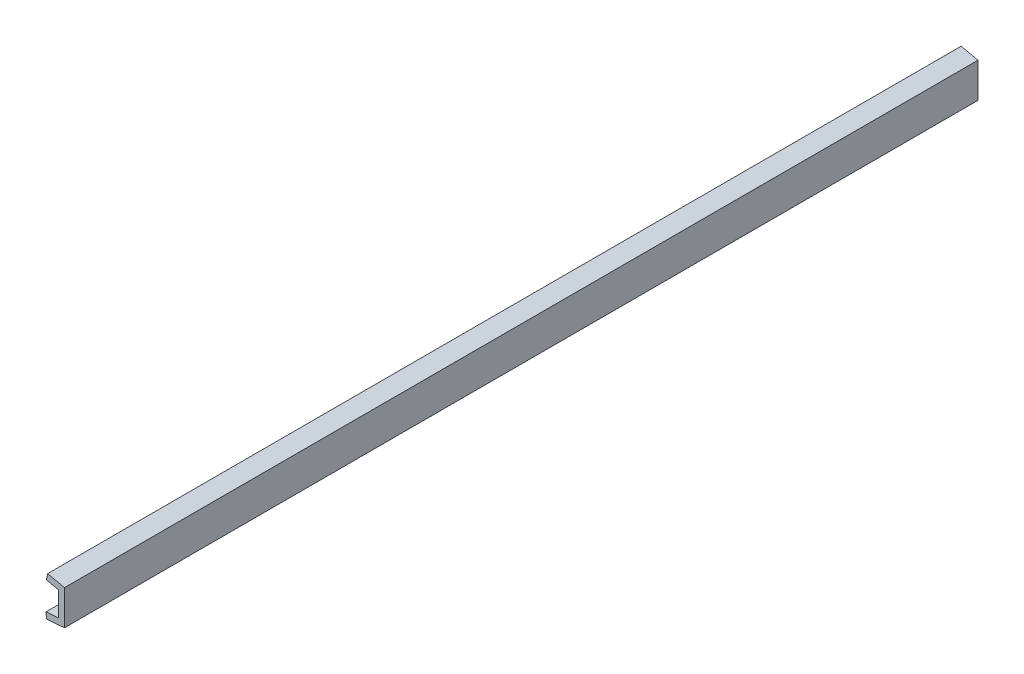
ISO-10303-21;
HEADER;
FILE_DESCRIPTION(('STEP AP214'),'2;1');
FILE_NAME('part.step','',(''),(''),'','','');
FILE_SCHEMA(('AUTOMOTIVE_DESIGN { 1 0 10303 214 1 1 1 1 }'));
ENDSEC;
DATA;
#1=APPLICATION_CONTEXT('core data for automotive mechanical design processes');
#2=APPLICATION_PROTOCOL_DEFINITION('international standard','automotive_design',2000,#1);
#3=PRODUCT_CONTEXT('',#1,'mechanical');
#4=PRODUCT('Part','Part','',(#3));
#5=PRODUCT_RELATED_PRODUCT_CATEGORY('part','',(#4));
#6=PRODUCT_DEFINITION_FORMATION('','',#4);
#7=PRODUCT_DEFINITION_CONTEXT('part definition',#1,'design');
#8=PRODUCT_DEFINITION('design','',#6,#7);
#9=PRODUCT_DEFINITION_SHAPE('','',#8);
#10=(LENGTH_UNIT() NAMED_UNIT(*) SI_UNIT(.MILLI.,.METRE.));
#11=(NAMED_UNIT(*) PLANE_ANGLE_UNIT() SI_UNIT($,.RADIAN.));
#12=(NAMED_UNIT(*) SI_UNIT($,.STERADIAN.) SOLID_ANGLE_UNIT());
#13=UNCERTAINTY_MEASURE_WITH_UNIT(LENGTH_MEASURE(1.E-05),#10,'distance_accuracy_value','');
#14=(GEOMETRIC_REPRESENTATION_CONTEXT(3) GLOBAL_UNCERTAINTY_ASSIGNED_CONTEXT((#13)) GLOBAL_UNIT_ASSIGNED_CONTEXT((#10,
#11,#12)) REPRESENTATION_CONTEXT('',''));
#15=CARTESIAN_POINT('',(0.,0.,0.));
#16=DIRECTION('',(0.,0.,1.));
#17=DIRECTION('',(1.,0.,0.));
#18=AXIS2_PLACEMENT_3D('',#15,#16,#17);
#19=CARTESIAN_POINT('',(208.349747658372,16.1617121481259,750.));
#20=DIRECTION('',(0.997004948709944,0.0773377802104559,0.));
#21=DIRECTION('',(-0.0773377802104559,0.997004948709945,0.));
#22=AXIS2_PLACEMENT_3D('',#19,#20,#21);
#23=PLANE('',#22);
#24=DIRECTION('',(0.0773377802104559,-0.997004948709945,0.));
#25=VECTOR('',#24,1.);
#26=CARTESIAN_POINT('',(208.349747658372,16.1617121481259,0.));
#27=LINE('',#26,#25);
#28=CARTESIAN_POINT('',(209.786901689684,-2.36545112676601,0.));
#29=VERTEX_POINT('',#28);
#30=CARTESIAN_POINT('',(210.173597998823,-7.35057137214407,0.));
#31=VERTEX_POINT('',#30);
#32=EDGE_CURVE('E135',#29,#31,#27,.T.);
#33=ORIENTED_EDGE('',*,*,#32,.T.);
#34=DIRECTION('',(0.,0.,-1.));
#35=VECTOR('',#34,1.);
#36=CARTESIAN_POINT('',(210.173597998823,-7.35057137214407,750.));
#37=LINE('',#36,#35);
#38=CARTESIAN_POINT('',(210.173597998823,-7.35057137214407,750.));
#39=VERTEX_POINT('',#38);
#40=EDGE_CURVE('E11',#39,#31,#37,.T.);
#41=ORIENTED_EDGE('',*,*,#40,.F.);
#42=DIRECTION('',(0.0773377802104559,-0.997004948709945,0.));
#43=VECTOR('',#42,1.);
#44=CARTESIAN_POINT('',(208.349747658372,16.1617121481259,750.));
#45=LINE('',#44,#43);
#46=CARTESIAN_POINT('',(209.786901689684,-2.36545112676601,750.));
#47=VERTEX_POINT('',#46);
#48=EDGE_CURVE('E162',#47,#39,#45,.T.);
#49=ORIENTED_EDGE('',*,*,#48,.F.);
#50=DIRECTION('',(0.,0.,-1.));
#51=VECTOR('',#50,1.);
#52=CARTESIAN_POINT('',(209.786901689684,-2.36545112676601,750.));
#53=LINE('',#52,#51);
#54=EDGE_CURVE('E131',#47,#29,#53,.T.);
#55=ORIENTED_EDGE('',*,*,#54,.T.);
#56=EDGE_LOOP('',(#33,#41,#49,#55));
#57=FACE_BOUND('',#56,.T.);
#58=ADVANCED_FACE('F41',(#57),#23,.F.);
#59=CARTESIAN_POINT('',(6.86010343152365E-10,-3.46758732944648E-09,750.));
#60=CARTESIAN_POINT('',(0.08168428698684,-0.412642687048914,750.));
#61=CARTESIAN_POINT('',(0.29643779221108,-1.23084882425444,750.));
#62=CARTESIAN_POINT('',(0.768361471156949,-2.41716894104676,750.));
#63=CARTESIAN_POINT('',(1.39503923147957,-3.55210015011684,750.));
#64=CARTESIAN_POINT('',(2.16439563511027,-4.63750206900586,750.));
#65=CARTESIAN_POINT('',(3.06393370947614,-5.68077839054713,750.));
#66=CARTESIAN_POINT('',(4.11804776311139,-6.66154416179366,750.));
#67=CARTESIAN_POINT('',(5.29953436327256,-7.60405965629537,750.));
#68=CARTESIAN_POINT('',(6.62863449802136,-8.49170476482325,750.));
#69=CARTESIAN_POINT('',(8.08798571884851,-9.34013183682808,750.));
#70=CARTESIAN_POINT('',(9.68204057253338,-10.139020115648,750.));
#71=CARTESIAN_POINT('',(11.4030680916886,-10.884858394614,750.));
#72=CARTESIAN_POINT('',(13.2505090341335,-11.589254086622,750.));
#73=CARTESIAN_POINT('',(15.2269841697117,-12.2280550439366,750.));
#74=CARTESIAN_POINT('',(17.3219522475322,-12.8451616004499,750.));
#75=CARTESIAN_POINT('',(19.5427708769133,-13.3974736552887,750.));
#76=CARTESIAN_POINT('',(21.8793057893119,-13.9187021646013,750.));
#77=CARTESIAN_POINT('',(24.3338022228834,-14.3886167059853,750.));
#78=CARTESIAN_POINT('',(26.9026774808353,-14.802759919061,750.));
#79=CARTESIAN_POINT('',(29.5790329825374,-15.1866441069216,750.));
#80=CARTESIAN_POINT('',(32.3647270664427,-15.5073171420312,750.));
#81=CARTESIAN_POINT('',(35.2497968202069,-15.8183955505852,750.));
#82=CARTESIAN_POINT('',(38.2422431604414,-16.0454461885373,750.));
#83=CARTESIAN_POINT('',(41.3318285242188,-16.2609817770736,750.));
#84=CARTESIAN_POINT('',(44.5190158754654,-16.4283061200292,750.));
#85=CARTESIAN_POINT('',(47.799283262828,-16.5581196969077,750.));
#86=CARTESIAN_POINT('',(51.1662389701078,-16.6479328939463,750.));
#87=CARTESIAN_POINT('',(54.6198609300622,-16.695073810502,750.));
#88=CARTESIAN_POINT('',(58.1599653505791,-16.7142959907614,750.));
#89=CARTESIAN_POINT('',(61.7835188431424,-16.7082647171375,750.));
#90=CARTESIAN_POINT('',(65.4834633590841,-16.6508259867193,750.));
#91=CARTESIAN_POINT('',(69.2569856491823,-16.5848920488685,750.));
#92=CARTESIAN_POINT('',(73.1037745798507,-16.4844848850199,750.));
#93=CARTESIAN_POINT('',(77.0202592722721,-16.3508026196804,750.));
#94=CARTESIAN_POINT('',(81.0039794969251,-16.2056434379451,750.));
#95=CARTESIAN_POINT('',(85.0500683642102,-16.0180896331925,750.));
#96=CARTESIAN_POINT('',(89.1571653787501,-15.8337159379273,750.));
#97=CARTESIAN_POINT('',(93.3201451343298,-15.6193919065088,750.));
#98=CARTESIAN_POINT('',(97.5368210232667,-15.3996749242203,750.));
#99=CARTESIAN_POINT('',(101.80725321727,-15.1737887607578,750.));
#100=CARTESIAN_POINT('',(106.123150677686,-14.9168069756067,750.));
#101=CARTESIAN_POINT('',(110.483633276907,-14.6718318403938,750.));
#102=CARTESIAN_POINT('',(114.883266317732,-14.4088537299499,750.));
#103=CARTESIAN_POINT('',(119.352975093204,-14.1438502002129,750.));
#104=CARTESIAN_POINT('',(123.894349232029,-13.8970193049098,750.));
#105=CARTESIAN_POINT('',(128.496857286776,-13.5995010083276,750.));
#106=CARTESIAN_POINT('',(133.130234778128,-13.3003240217907,750.));
#107=CARTESIAN_POINT('',(137.784055517228,-12.993867356776,750.));
#108=CARTESIAN_POINT('',(142.453682427155,-12.6614740565246,750.));
#109=CARTESIAN_POINT('',(147.129863452571,-12.318169380912,750.));
#110=CARTESIAN_POINT('',(151.814228379386,-11.9853167344393,750.));
#111=CARTESIAN_POINT('',(156.499893797324,-11.6185724445053,750.));
#112=CARTESIAN_POINT('',(161.183377828108,-11.2606019236378,750.));
#113=CARTESIAN_POINT('',(165.860460189637,-10.9025488597506,750.));
#114=CARTESIAN_POINT('',(170.523341725827,-10.5300973915269,750.));
#115=CARTESIAN_POINT('',(175.170121140126,-10.1615202930905,750.));
#116=CARTESIAN_POINT('',(179.793367843169,-9.79042877802554,750.));
#117=CARTESIAN_POINT('',(184.390167200322,-9.42207701846059,750.));
#118=CARTESIAN_POINT('',(188.959593481163,-9.04825961775901,750.));
#119=CARTESIAN_POINT('',(193.496862610415,-8.69245709593373,750.));
#120=CARTESIAN_POINT('',(197.993446271768,-8.33140201520253,750.));
#121=CARTESIAN_POINT('',(202.443627904182,-7.97364305459564,750.));
#122=CARTESIAN_POINT('',(206.842502753098,-7.60628208488407,750.));
#123=CARTESIAN_POINT('',(211.190292550163,-7.27370176009231,750.));
#124=CARTESIAN_POINT('',(215.480211958673,-6.93265212483035,750.));
#125=CARTESIAN_POINT('',(219.709739235407,-6.59006458587067,750.));
#126=CARTESIAN_POINT('',(223.873233644342,-6.26206836723984,750.));
#127=CARTESIAN_POINT('',(227.966396089271,-5.9398476619633,750.));
#128=CARTESIAN_POINT('',(231.983748001244,-5.63533938180436,750.));
#129=CARTESIAN_POINT('',(235.919297627122,-5.31754575452866,750.));
#130=CARTESIAN_POINT('',(239.77370870658,-5.03491559697022,750.));
#131=CARTESIAN_POINT('',(243.536538120906,-4.74165773777177,750.));
#132=CARTESIAN_POINT('',(247.209812190136,-4.46085993007788,750.));
#133=CARTESIAN_POINT('',(250.787106764707,-4.19576061649392,750.));
#134=CARTESIAN_POINT('',(254.266072169246,-3.91883561359546,750.));
#135=CARTESIAN_POINT('',(257.643250160136,-3.6721839334308,750.));
#136=CARTESIAN_POINT('',(260.913793207287,-3.4361759851998,750.));
#137=CARTESIAN_POINT('',(264.072684975458,-3.18790963619195,750.));
#138=CARTESIAN_POINT('',(267.117194027154,-2.9771463747341,750.));
#139=CARTESIAN_POINT('',(270.043161250345,-2.75101341585552,750.));
#140=CARTESIAN_POINT('',(272.846765873569,-2.54470011257798,750.));
#141=CARTESIAN_POINT('',(275.52942919854,-2.33878815971674,750.));
#142=CARTESIAN_POINT('',(278.087148077472,-2.16666667438527,750.));
#143=CARTESIAN_POINT('',(280.513268395164,-1.98242531383613,750.));
#144=CARTESIAN_POINT('',(282.806745265545,-1.81443576932335,750.));
#145=CARTESIAN_POINT('',(284.962823137036,-1.64955214309113,750.));
#146=CARTESIAN_POINT('',(286.983837233579,-1.51701069421092,750.));
#147=CARTESIAN_POINT('',(288.86325736509,-1.37227380954508,750.));
#148=CARTESIAN_POINT('',(290.600165155571,-1.24558756488331,750.));
#149=CARTESIAN_POINT('',(292.192790163112,-1.11915950224588,750.));
#150=CARTESIAN_POINT('',(293.640594785675,-1.02816418679108,750.));
#151=CARTESIAN_POINT('',(294.939565332546,-0.92070431694592,750.));
#152=CARTESIAN_POINT('',(296.089960300949,-0.842870725052759,750.));
#153=CARTESIAN_POINT('',(297.090587220823,-0.777681987494267,750.));
#154=CARTESIAN_POINT('',(297.939585238316,-0.70130185738506,750.));
#155=CARTESIAN_POINT('',(298.636651950482,-0.653077401387046,750.));
#156=CARTESIAN_POINT('',(299.177018781558,-0.618208826708505,750.));
#157=CARTESIAN_POINT('',(299.562595701666,-0.575799674164568,750.));
#158=CARTESIAN_POINT('',(299.79734919339,-0.578243239164238,750.));
#159=CARTESIAN_POINT('',(299.90336017084,-0.563663730262078,750.));
#160=CARTESIAN_POINT('',(299.929999999991,-0.559999999999512,750.));
#161=B_SPLINE_CURVE_WITH_KNOTS('',3,(#59,#60,#61,#62,#63,#64,#65,#66,#67,#68,#69,#70,#71,#72,
#73,#74,#75,#76,#77,#78,#79,#80,#81,#82,#83,#84,#85,#86,#87,#88,#89,#90,#91,#92,#93,#94,#95,#96,
#97,#98,#99,#100,#101,#102,#103,#104,#105,#106,#107,#108,#109,#110,#111,#112,#113,#114,#115,
#116,#117,#118,#119,#120,#121,#122,#123,#124,#125,#126,#127,#128,#129,#130,#131,#132,#133,#134,
#135,#136,#137,#138,#139,#140,#141,#142,#143,#144,#145,#146,#147,#148,#149,#150,#151,#152,#153,
#154,#155,#156,#157,#158,#159,#160),.UNSPECIFIED.,.F.,.F.,(4,1,1,1,1,1,1,1,1,1,1,1,1,1,1,1,1,1,
1,1,1,1,1,1,1,1,1,1,1,1,1,1,1,1,1,1,1,1,1,1,1,1,1,1,1,1,1,1,1,1,1,1,1,1,1,1,1,1,1,1,1,1,1,1,1,1,
1,1,1,1,1,1,1,1,1,1,1,1,1,1,1,1,1,1,1,1,1,1,1,1,1,1,1,1,1,1,1,1,1,4),(0.510394165054345,
0.512411362351637,0.514442775005336,0.516504186146814,0.518616282986581,0.520815941374538,
0.52310137417107,0.52551420412258,0.528060370238057,0.530762306993531,0.533608996019813,
0.536610005944519,0.539758552070476,0.543091515136878,0.546573596537661,0.550235349948387,
0.554069096490516,0.558058926974622,0.562223754924467,0.566552856289207,0.571030234918836,
0.575677161731586,0.580474566261676,0.585427924053139,0.590537055672864,0.595787006934838,
0.601178701806172,0.606697001543169,0.612358752726766,0.618164376111839,0.624082471505276,
0.630113019620036,0.636272552317013,0.64254540865324,0.648915297875715,0.655399015903059,
0.661979320195946,0.668641043209263,0.675399420045521,0.682238498238121,0.689159203277062,
0.696143776007776,0.703193143687113,0.710306374538354,0.717627174011905,0.725014701728468,
0.732435170353137,0.739904563937781,0.747392102399747,0.754896736460748,0.762401370521748,
0.769924336473027,0.777447302424306,0.784938375809219,0.792430695411681,0.799891128581962,
0.807303733725319,0.814684454614634,0.822017350797373,0.829301142641949,0.836521162869281,
0.843661473655919,0.850722080825709,0.857700425049739,0.864583104763581,0.87137012832007,
0.87806022371642,0.884621511633568,0.891069943428069,0.897390814479484,0.903565713862671,
0.909613035181241,0.915499668178881,0.921241563258684,0.926823990297297,0.932244523470366,
0.93748842971305,0.942556896933455,0.947447554919404,0.952130861472029,0.956637537170943,
0.960935685066861,0.965040101801286,0.968937143772775,0.972609708612879,0.97607374592087,
0.979312161013132,0.982327244194811,0.985117850528837,0.987668031890042,0.989992582174607,
0.992077865387908,0.993921550450856,0.995524803260075,0.996888843664504,0.998011233445347,
0.998877242772344,0.999486882686978,0.999871057150102,1.),.UNSPECIFIED.);
#162=DIRECTION('',(0.,0.,-1.));
#163=VECTOR('',#162,1.);
#164=SURFACE_OF_LINEAR_EXTRUSION('',#161,#163);
#165=CARTESIAN_POINT('',(6.86010343152365E-10,-3.46758732944648E-09,0.));
#166=CARTESIAN_POINT('',(0.08168428698684,-0.412642687048914,0.));
#167=CARTESIAN_POINT('',(0.29643779221108,-1.23084882425444,0.));
#168=CARTESIAN_POINT('',(0.768361471156949,-2.41716894104676,0.));
#169=CARTESIAN_POINT('',(1.39503923147957,-3.55210015011684,0.));
#170=CARTESIAN_POINT('',(2.16439563511027,-4.63750206900586,0.));
#171=CARTESIAN_POINT('',(3.06393370947614,-5.68077839054713,0.));
#172=CARTESIAN_POINT('',(4.11804776311139,-6.66154416179366,0.));
#173=CARTESIAN_POINT('',(5.29953436327256,-7.60405965629537,0.));
#174=CARTESIAN_POINT('',(6.62863449802136,-8.49170476482325,0.));
#175=CARTESIAN_POINT('',(8.08798571884851,-9.34013183682808,0.));
#176=CARTESIAN_POINT('',(9.68204057253338,-10.139020115648,0.));
#177=CARTESIAN_POINT('',(11.4030680916886,-10.884858394614,0.));
#178=CARTESIAN_POINT('',(13.2505090341335,-11.589254086622,0.));
#179=CARTESIAN_POINT('',(15.2269841697117,-12.2280550439366,0.));
#180=CARTESIAN_POINT('',(17.3219522475322,-12.8451616004499,0.));
#181=CARTESIAN_POINT('',(19.5427708769133,-13.3974736552887,0.));
#182=CARTESIAN_POINT('',(21.8793057893119,-13.9187021646013,0.));
#183=CARTESIAN_POINT('',(24.3338022228834,-14.3886167059853,0.));
#184=CARTESIAN_POINT('',(26.9026774808353,-14.802759919061,0.));
#185=CARTESIAN_POINT('',(29.5790329825374,-15.1866441069216,0.));
#186=CARTESIAN_POINT('',(32.3647270664427,-15.5073171420312,0.));
#187=CARTESIAN_POINT('',(35.2497968202069,-15.8183955505852,0.));
#188=CARTESIAN_POINT('',(38.2422431604414,-16.0454461885373,0.));
#189=CARTESIAN_POINT('',(41.3318285242188,-16.2609817770736,0.));
#190=CARTESIAN_POINT('',(44.5190158754654,-16.4283061200292,0.));
#191=CARTESIAN_POINT('',(47.799283262828,-16.5581196969077,0.));
#192=CARTESIAN_POINT('',(51.1662389701078,-16.6479328939463,0.));
#193=CARTESIAN_POINT('',(54.6198609300622,-16.695073810502,0.));
#194=CARTESIAN_POINT('',(58.1599653505791,-16.7142959907614,0.));
#195=CARTESIAN_POINT('',(61.7835188431424,-16.7082647171375,0.));
#196=CARTESIAN_POINT('',(65.4834633590841,-16.6508259867193,0.));
#197=CARTESIAN_POINT('',(69.2569856491823,-16.5848920488685,0.));
#198=CARTESIAN_POINT('',(73.1037745798507,-16.4844848850199,0.));
#199=CARTESIAN_POINT('',(77.0202592722721,-16.3508026196804,0.));
#200=CARTESIAN_POINT('',(81.0039794969251,-16.2056434379451,0.));
#201=CARTESIAN_POINT('',(85.0500683642102,-16.0180896331925,0.));
#202=CARTESIAN_POINT('',(89.1571653787501,-15.8337159379273,0.));
#203=CARTESIAN_POINT('',(93.3201451343298,-15.6193919065088,0.));
#204=CARTESIAN_POINT('',(97.5368210232667,-15.3996749242203,0.));
#205=CARTESIAN_POINT('',(101.80725321727,-15.1737887607578,0.));
#206=CARTESIAN_POINT('',(106.123150677686,-14.9168069756067,0.));
#207=CARTESIAN_POINT('',(110.483633276907,-14.6718318403938,0.));
#208=CARTESIAN_POINT('',(114.883266317732,-14.4088537299499,0.));
#209=CARTESIAN_POINT('',(119.352975093204,-14.1438502002129,0.));
#210=CARTESIAN_POINT('',(123.894349232029,-13.8970193049098,0.));
#211=CARTESIAN_POINT('',(128.496857286776,-13.5995010083276,0.));
#212=CARTESIAN_POINT('',(133.130234778128,-13.3003240217907,0.));
#213=CARTESIAN_POINT('',(137.784055517228,-12.993867356776,0.));
#214=CARTESIAN_POINT('',(142.453682427155,-12.6614740565246,0.));
#215=CARTESIAN_POINT('',(147.129863452571,-12.318169380912,0.));
#216=CARTESIAN_POINT('',(151.814228379386,-11.9853167344393,0.));
#217=CARTESIAN_POINT('',(156.499893797324,-11.6185724445053,0.));
#218=CARTESIAN_POINT('',(161.183377828108,-11.2606019236378,0.));
#219=CARTESIAN_POINT('',(165.860460189637,-10.9025488597506,0.));
#220=CARTESIAN_POINT('',(170.523341725827,-10.5300973915269,0.));
#221=CARTESIAN_POINT('',(175.170121140126,-10.1615202930905,0.));
#222=CARTESIAN_POINT('',(179.793367843169,-9.79042877802554,0.));
#223=CARTESIAN_POINT('',(184.390167200322,-9.42207701846059,0.));
#224=CARTESIAN_POINT('',(188.959593481163,-9.04825961775901,0.));
#225=CARTESIAN_POINT('',(193.496862610415,-8.69245709593373,0.));
#226=CARTESIAN_POINT('',(197.993446271768,-8.33140201520253,0.));
#227=CARTESIAN_POINT('',(202.443627904182,-7.97364305459564,0.));
#228=CARTESIAN_POINT('',(206.842502753098,-7.60628208488407,0.));
#229=CARTESIAN_POINT('',(211.190292550163,-7.27370176009231,0.));
#230=CARTESIAN_POINT('',(215.480211958673,-6.93265212483035,0.));
#231=CARTESIAN_POINT('',(219.709739235407,-6.59006458587067,0.));
#232=CARTESIAN_POINT('',(223.873233644342,-6.26206836723984,0.));
#233=CARTESIAN_POINT('',(227.966396089271,-5.9398476619633,0.));
#234=CARTESIAN_POINT('',(231.983748001244,-5.63533938180436,0.));
#235=CARTESIAN_POINT('',(235.919297627122,-5.31754575452866,0.));
#236=CARTESIAN_POINT('',(239.77370870658,-5.03491559697022,0.));
#237=CARTESIAN_POINT('',(243.536538120906,-4.74165773777177,0.));
#238=CARTESIAN_POINT('',(247.209812190136,-4.46085993007788,0.));
#239=CARTESIAN_POINT('',(250.787106764707,-4.19576061649392,0.));
#240=CARTESIAN_POINT('',(254.266072169246,-3.91883561359546,0.));
#241=CARTESIAN_POINT('',(257.643250160136,-3.6721839334308,0.));
#242=CARTESIAN_POINT('',(260.913793207287,-3.4361759851998,0.));
#243=CARTESIAN_POINT('',(264.072684975458,-3.18790963619195,0.));
#244=CARTESIAN_POINT('',(267.117194027154,-2.9771463747341,0.));
#245=CARTESIAN_POINT('',(270.043161250345,-2.75101341585552,0.));
#246=CARTESIAN_POINT('',(272.846765873569,-2.54470011257798,0.));
#247=CARTESIAN_POINT('',(275.52942919854,-2.33878815971674,0.));
#248=CARTESIAN_POINT('',(278.087148077472,-2.16666667438527,0.));
#249=CARTESIAN_POINT('',(280.513268395164,-1.98242531383613,0.));
#250=CARTESIAN_POINT('',(282.806745265545,-1.81443576932335,0.));
#251=CARTESIAN_POINT('',(284.962823137036,-1.64955214309113,0.));
#252=CARTESIAN_POINT('',(286.983837233579,-1.51701069421092,0.));
#253=CARTESIAN_POINT('',(288.86325736509,-1.37227380954508,0.));
#254=CARTESIAN_POINT('',(290.600165155571,-1.24558756488331,0.));
#255=CARTESIAN_POINT('',(292.192790163112,-1.11915950224588,0.));
#256=CARTESIAN_POINT('',(293.640594785675,-1.02816418679108,0.));
#257=CARTESIAN_POINT('',(294.939565332546,-0.92070431694592,0.));
#258=CARTESIAN_POINT('',(296.089960300949,-0.842870725052759,0.));
#259=CARTESIAN_POINT('',(297.090587220823,-0.777681987494267,0.));
#260=CARTESIAN_POINT('',(297.939585238316,-0.70130185738506,0.));
#261=CARTESIAN_POINT('',(298.636651950482,-0.653077401387046,0.));
#262=CARTESIAN_POINT('',(299.177018781558,-0.618208826708505,0.));
#263=CARTESIAN_POINT('',(299.562595701666,-0.575799674164568,0.));
#264=CARTESIAN_POINT('',(299.79734919339,-0.578243239164238,0.));
#265=CARTESIAN_POINT('',(299.90336017084,-0.563663730262078,0.));
#266=CARTESIAN_POINT('',(299.929999999991,-0.559999999999512,0.));
#267=B_SPLINE_CURVE_WITH_KNOTS('',3,(#165,#166,#167,#168,#169,#170,#171,#172,#173,#174,#175,
#176,#177,#178,#179,#180,#181,#182,#183,#184,#185,#186,#187,#188,#189,#190,#191,#192,#193,#194,
#195,#196,#197,#198,#199,#200,#201,#202,#203,#204,#205,#206,#207,#208,#209,#210,#211,#212,#213,
#214,#215,#216,#217,#218,#219,#220,#221,#222,#223,#224,#225,#226,#227,#228,#229,#230,#231,#232,
#233,#234,#235,#236,#237,#238,#239,#240,#241,#242,#243,#244,#245,#246,#247,#248,#249,#250,#251,
#252,#253,#254,#255,#256,#257,#258,#259,#260,#261,#262,#263,#264,#265,#266),.UNSPECIFIED.,.F.,
.F.,(4,1,1,1,1,1,1,1,1,1,1,1,1,1,1,1,1,1,1,1,1,1,1,1,1,1,1,1,1,1,1,1,1,1,1,1,1,1,1,1,1,1,1,1,1,
1,1,1,1,1,1,1,1,1,1,1,1,1,1,1,1,1,1,1,1,1,1,1,1,1,1,1,1,1,1,1,1,1,1,1,1,1,1,1,1,1,1,1,1,1,1,1,1,
1,1,1,1,1,1,4),(0.510394165054345,0.512411362351637,0.514442775005336,0.516504186146814,
0.518616282986581,0.520815941374538,0.52310137417107,0.52551420412258,0.528060370238057,
0.530762306993531,0.533608996019813,0.536610005944519,0.539758552070476,0.543091515136878,
0.546573596537661,0.550235349948387,0.554069096490516,0.558058926974622,0.562223754924467,
0.566552856289207,0.571030234918836,0.575677161731586,0.580474566261676,0.585427924053139,
0.590537055672864,0.595787006934838,0.601178701806172,0.606697001543169,0.612358752726766,
0.618164376111839,0.624082471505276,0.630113019620036,0.636272552317013,0.64254540865324,
0.648915297875715,0.655399015903059,0.661979320195946,0.668641043209263,0.675399420045521,
0.682238498238121,0.689159203277062,0.696143776007776,0.703193143687113,0.710306374538354,
0.717627174011905,0.725014701728468,0.732435170353137,0.739904563937781,0.747392102399747,
0.754896736460748,0.762401370521748,0.769924336473027,0.777447302424306,0.784938375809219,
0.792430695411681,0.799891128581962,0.807303733725319,0.814684454614634,0.822017350797373,
0.829301142641949,0.836521162869281,0.843661473655919,0.850722080825709,0.857700425049739,
0.864583104763581,0.87137012832007,0.87806022371642,0.884621511633568,0.891069943428069,
0.897390814479484,0.903565713862671,0.909613035181241,0.915499668178881,0.921241563258684,
0.926823990297297,0.932244523470366,0.93748842971305,0.942556896933455,0.947447554919404,
0.952130861472029,0.956637537170943,0.960935685066861,0.965040101801286,0.968937143772775,
0.972609708612879,0.97607374592087,0.979312161013132,0.982327244194811,0.985117850528837,
0.987668031890042,0.989992582174607,0.992077865387908,0.993921550450856,0.995524803260075,
0.996888843664504,0.998011233445347,0.998877242772344,0.999486882686978,0.999871057150102,1.),.UNSPECIFIED.);
#268=CARTESIAN_POINT('',(224.93,-6.17892625428886,0.));
#269=VERTEX_POINT('',#268);
#270=EDGE_CURVE('E138',#31,#269,#267,.T.);
#271=ORIENTED_EDGE('',*,*,#270,.T.);
#272=DIRECTION('',(0.,0.,-1.));
#273=VECTOR('',#272,1.);
#274=CARTESIAN_POINT('',(224.93,-6.17892625428886,750.));
#275=LINE('',#274,#273);
#276=CARTESIAN_POINT('',(224.93,-6.17892625428886,750.));
#277=VERTEX_POINT('',#276);
#278=EDGE_CURVE('E49',#277,#269,#275,.T.);
#279=ORIENTED_EDGE('',*,*,#278,.F.);
#280=EDGE_CURVE('E96',#39,#277,#161,.T.);
#281=ORIENTED_EDGE('',*,*,#280,.F.);
#282=ORIENTED_EDGE('',*,*,#40,.T.);
#283=EDGE_LOOP('',(#271,#279,#281,#282));
#284=FACE_BOUND('',#283,.T.);
#285=ADVANCED_FACE('F203',(#284),#164,.F.);
#286=CARTESIAN_POINT('',(224.93,8.74619824169714E-13,750.));
#287=DIRECTION('',(-1.,0.,0.));
#288=DIRECTION('',(0.,-1.,0.));
#289=AXIS2_PLACEMENT_3D('',#286,#287,#288);
#290=PLANE('',#289);
#291=DIRECTION('',(0.,1.,0.));
#292=VECTOR('',#291,1.);
#293=CARTESIAN_POINT('',(224.93,8.74619824169714E-13,0.));
#294=LINE('',#293,#292);
#295=CARTESIAN_POINT('',(224.93,22.3731895368208,0.));
#296=VERTEX_POINT('',#295);
#297=EDGE_CURVE('E142',#269,#296,#294,.T.);
#298=ORIENTED_EDGE('',*,*,#297,.T.);
#299=DIRECTION('',(0.,0.,-1.));
#300=VECTOR('',#299,1.);
#301=CARTESIAN_POINT('',(224.93,22.3731895368208,750.));
#302=LINE('',#301,#300);
#303=CARTESIAN_POINT('',(224.93,22.3731895368208,750.));
#304=VERTEX_POINT('',#303);
#305=EDGE_CURVE('E168',#304,#296,#302,.T.);
#306=ORIENTED_EDGE('',*,*,#305,.F.);
#307=DIRECTION('',(0.,1.,0.));
#308=VECTOR('',#307,1.);
#309=CARTESIAN_POINT('',(224.93,8.74619824169714E-13,750.));
#310=LINE('',#309,#308);
#311=EDGE_CURVE('E176',#277,#304,#310,.T.);
#312=ORIENTED_EDGE('',*,*,#311,.F.);
#313=ORIENTED_EDGE('',*,*,#278,.T.);
#314=EDGE_LOOP('',(#298,#306,#312,#313));
#315=FACE_BOUND('',#314,.T.);
#316=ADVANCED_FACE('F174',(#315),#290,.F.);
#317=CARTESIAN_POINT('',(300.070000000009,0.559999999999606,750.));
#318=CARTESIAN_POINT('',(300.046727210838,0.57014946527181,750.));
#319=CARTESIAN_POINT('',(299.951918410927,0.611496405472444,750.));
#320=CARTESIAN_POINT('',(299.731451090185,0.687910176410011,750.));
#321=CARTESIAN_POINT('',(299.360701306177,0.802077760347153,750.));
#322=CARTESIAN_POINT('',(298.851143071171,0.990049760142529,750.));
#323=CARTESIAN_POINT('',(298.192762058047,1.21498955742899,750.));
#324=CARTESIAN_POINT('',(297.39058131591,1.49834771116358,750.));
#325=CARTESIAN_POINT('',(296.440162643631,1.82713144456083,750.));
#326=CARTESIAN_POINT('',(295.347552696138,2.20591589840112,750.));
#327=CARTESIAN_POINT('',(294.109915847856,2.62641666355169,750.));
#328=CARTESIAN_POINT('',(292.734867314937,3.09787554254288,750.));
#329=CARTESIAN_POINT('',(291.212205013657,3.60330160879851,750.));
#330=CARTESIAN_POINT('',(289.556778296054,4.17036010371409,750.));
#331=CARTESIAN_POINT('',(287.754541523661,4.75022942363347,750.));
#332=CARTESIAN_POINT('',(285.826587722534,5.39992229408479,750.));
#333=CARTESIAN_POINT('',(283.756363975349,6.06242105527255,750.));
#334=CARTESIAN_POINT('',(281.558560220993,6.77588707650856,750.));
#335=CARTESIAN_POINT('',(279.225625429957,7.5173074076064,750.));
#336=CARTESIAN_POINT('',(276.759052145959,8.2802981760638,750.));
#337=CARTESIAN_POINT('',(274.172767845115,9.09557710973343,750.));
#338=CARTESIAN_POINT('',(271.45955356681,9.92624020632865,750.));
#339=CARTESIAN_POINT('',(268.620233524828,10.7707661803998,750.));
#340=CARTESIAN_POINT('',(265.66703106841,11.6559297276713,750.));
#341=CARTESIAN_POINT('',(262.589976023508,12.5399347522996,750.));
#342=CARTESIAN_POINT('',(259.406507792868,13.4644296130216,750.));
#343=CARTESIAN_POINT('',(256.106091200659,14.3932678621578,750.));
#344=CARTESIAN_POINT('',(252.694259978673,15.3300326956432,750.));
#345=CARTESIAN_POINT('',(249.183398903871,16.2926089703338,750.));
#346=CARTESIAN_POINT('',(245.565461502502,17.2514346555858,750.));
#347=CARTESIAN_POINT('',(241.852861879338,18.2210826299672,750.));
#348=CARTESIAN_POINT('',(238.042855475645,19.1913810301566,750.));
#349=CARTESIAN_POINT('',(234.140998951705,20.157357319934,750.));
#350=CARTESIAN_POINT('',(230.154027102527,21.1433044568455,750.));
#351=CARTESIAN_POINT('',(226.07941307726,22.108408476858,750.));
#352=CARTESIAN_POINT('',(221.926457871224,23.0703556384359,750.));
#353=CARTESIAN_POINT('',(217.6962775731,24.0199849043638,750.));
#354=CARTESIAN_POINT('',(213.392335784255,24.9575190841546,750.));
#355=CARTESIAN_POINT('',(209.022179153199,25.8870238282288,750.));
#356=CARTESIAN_POINT('',(204.590060503874,26.8099246596024,750.));
#357=CARTESIAN_POINT('',(200.100470304697,27.7094915488814,750.));
#358=CARTESIAN_POINT('',(195.551555783891,28.5748749529662,750.));
#359=CARTESIAN_POINT('',(190.95710115256,29.4405805115664,750.));
#360=CARTESIAN_POINT('',(186.312819207174,30.2661537119284,750.));
#361=CARTESIAN_POINT('',(181.629850434367,31.0690924620077,750.));
#362=CARTESIAN_POINT('',(176.9116334721,31.8335044141093,750.));
#363=CARTESIAN_POINT('',(172.163553807855,32.5897563409087,750.));
#364=CARTESIAN_POINT('',(167.38637831359,33.2979132291314,750.));
#365=CARTESIAN_POINT('',(162.585397476233,33.965141895421,750.));
#366=CARTESIAN_POINT('',(157.772606772563,34.6069052400814,750.));
#367=CARTESIAN_POINT('',(152.945783838143,35.2070309507983,750.));
#368=CARTESIAN_POINT('',(148.116103717064,35.7683712182421,750.));
#369=CARTESIAN_POINT('',(143.281947921397,36.2759641136444,750.));
#370=CARTESIAN_POINT('',(138.451826021007,36.7461668630659,750.));
#371=CARTESIAN_POINT('',(133.632024585046,37.1774202436999,750.));
#372=CARTESIAN_POINT('',(128.825099135922,37.5570095720901,750.));
#373=CARTESIAN_POINT('',(124.0352682766,37.8909649193306,750.));
#374=CARTESIAN_POINT('',(119.227934324095,38.1580563961838,750.));
#375=CARTESIAN_POINT('',(114.414879536341,38.3839309655849,750.));
#376=CARTESIAN_POINT('',(109.600810746422,38.5231711888418,750.));
#377=CARTESIAN_POINT('',(104.830170116063,38.5812091028124,750.));
#378=CARTESIAN_POINT('',(100.103024464491,38.5711871037619,750.));
#379=CARTESIAN_POINT('',(95.4289177756723,38.4952426315103,750.));
#380=CARTESIAN_POINT('',(90.8118079707387,38.3323263522947,750.));
#381=CARTESIAN_POINT('',(86.2578215279774,38.1037402151062,750.));
#382=CARTESIAN_POINT('',(81.7706420322065,37.8028926780969,750.));
#383=CARTESIAN_POINT('',(77.3556639029616,37.4394017022477,750.));
#384=CARTESIAN_POINT('',(73.0231073717325,36.9817558492871,750.));
#385=CARTESIAN_POINT('',(68.7745873700511,36.4785227821482,750.));
#386=CARTESIAN_POINT('',(64.6181040246302,35.8952175381654,750.));
#387=CARTESIAN_POINT('',(60.552867782823,35.2591686102274,750.));
#388=CARTESIAN_POINT('',(56.5894272314716,34.548268384025,750.));
#389=CARTESIAN_POINT('',(52.728147609376,33.7805282280188,750.));
#390=CARTESIAN_POINT('',(48.9784809853801,32.9486222007632,750.));
#391=CARTESIAN_POINT('',(45.3406482062456,32.0705009481565,750.));
#392=CARTESIAN_POINT('',(41.8175978305396,31.1446852043062,750.));
#393=CARTESIAN_POINT('',(38.4225138687805,30.1522778689638,750.));
#394=CARTESIAN_POINT('',(35.1484262755672,29.1221398243421,750.));
#395=CARTESIAN_POINT('',(32.0024888843364,28.0567605707498,750.));
#396=CARTESIAN_POINT('',(28.9910532160996,26.947357350049,750.));
#397=CARTESIAN_POINT('',(26.1161432589965,25.7977619494281,750.));
#398=CARTESIAN_POINT('',(23.3820300010664,24.605992476619,750.));
#399=CARTESIAN_POINT('',(20.7789312399974,23.403436919697,750.));
#400=CARTESIAN_POINT('',(18.3282822679355,22.1583471316499,750.));
#401=CARTESIAN_POINT('',(16.0188302677939,20.9064502673966,750.));
#402=CARTESIAN_POINT('',(13.8628973732302,19.6215652077166,750.));
#403=CARTESIAN_POINT('',(11.8547380257014,18.3242676681531,750.));
#404=CARTESIAN_POINT('',(9.99188655882919,17.0192098294199,750.));
#405=CARTESIAN_POINT('',(8.29105075030026,15.6956485942382,750.));
#406=CARTESIAN_POINT('',(6.73373760295228,14.3771786431372,750.));
#407=CARTESIAN_POINT('',(5.33311142752208,13.0499076520752,750.));
#408=CARTESIAN_POINT('',(4.08838789599282,11.7194177408118,750.));
#409=CARTESIAN_POINT('',(3.00075757832663,10.3893770732718,750.));
#410=CARTESIAN_POINT('',(2.0837737167411,9.05642543101119,750.));
#411=CARTESIAN_POINT('',(1.29666389493232,7.74190201537552,750.));
#412=CARTESIAN_POINT('',(0.688475961139798,6.42274039721468,750.));
#413=CARTESIAN_POINT('',(0.232629270456275,5.11301943414384,750.));
#414=CARTESIAN_POINT('',(-0.0741168979006899,3.81676478454145,750.));
#415=CARTESIAN_POINT('',(-0.216963808852273,2.52703073355145,750.));
#416=CARTESIAN_POINT('',(-0.194835648763117,1.25098158157196,750.));
#417=CARTESIAN_POINT('',(-0.0816996889988518,0.412720493044762,750.));
#418=CARTESIAN_POINT('',(6.86038103125013E-10,-3.46758561693545E-09,750.));
#419=B_SPLINE_CURVE_WITH_KNOTS('',3,(#317,#318,#319,#320,#321,#322,#323,#324,#325,#326,#327,
#328,#329,#330,#331,#332,#333,#334,#335,#336,#337,#338,#339,#340,#341,#342,#343,#344,#345,#346,
#347,#348,#349,#350,#351,#352,#353,#354,#355,#356,#357,#358,#359,#360,#361,#362,#363,#364,#365,
#366,#367,#368,#369,#370,#371,#372,#373,#374,#375,#376,#377,#378,#379,#380,#381,#382,#383,#384,
#385,#386,#387,#388,#389,#390,#391,#392,#393,#394,#395,#396,#397,#398,#399,#400,#401,#402,#403,
#404,#405,#406,#407,#408,#409,#410,#411,#412,#413,#414,#415,#416,#417,#418),.UNSPECIFIED.,.F.,
.F.,(4,1,1,1,1,1,1,1,1,1,1,1,1,1,1,1,1,1,1,1,1,1,1,1,1,1,1,1,1,1,1,1,1,1,1,1,1,1,1,1,1,1,1,1,1,
1,1,1,1,1,1,1,1,1,1,1,1,1,1,1,1,1,1,1,1,1,1,1,1,1,1,1,1,1,1,1,1,1,1,1,1,1,1,1,1,1,1,1,1,1,1,1,1,
1,1,1,1,1,1,4),(0.,0.000121802045916605,0.000496197757592308,0.00111829754146197,
0.00198327247421803,0.00310109503456608,0.00445667065088207,0.00606510026662876,
0.00792639033067934,0.0100051006761166,0.0123366827495954,0.0149008679576207,0.0177027715059171,
0.0207322847510818,0.0239842963399837,0.027464026273719,0.031161268245018,0.0350711538259491,
0.0392090248767433,0.0435491612294342,0.0480820960038832,0.0528232938835928,0.0577621196773443,
0.0628742543135626,0.0681840845984971,0.0736674862169605,0.0793246499392333,0.0851599372063481,
0.0911342131365787,0.0972826896563106,0.103570554381949,0.10999800798771,0.116569034804591,
0.123276218058606,0.13008874608338,0.137022467248384,0.144077656318622,0.151223284866333,
0.158459530455229,0.165799086141327,0.173192203581115,0.180676632663918,0.188231102607015,
0.195824579266017,0.203473250814262,0.211164226832504,0.218892941548552,0.22664419478934,
0.234420668227768,0.242188980013251,0.249981422868409,0.257749174871681,0.265510469999164,
0.273265830607315,0.280966677998178,0.288645671703493,0.296302699243563,0.304067470550499,
0.31176355002067,0.319408993713125,0.326957891756819,0.334443892775123,0.341837269696896,
0.349123554457684,0.356320598702043,0.363414402847302,0.370376839159325,0.377222795683193,
0.383940401176468,0.390513899376016,0.396964016788803,0.403259098024054,0.40940176833071,
0.415391074824066,0.421213921667111,0.426877502278438,0.432360647328028,0.437681281381694,
0.442812194902764,0.447757076574934,0.452534712671014,0.457121248364812,0.461512912707052,
0.465721241925177,0.469723075006934,0.473551513613339,0.477190036693361,0.48063229623885,
0.483888395344838,0.486976776934193,0.489884980817169,0.492625083473646,0.495211517132313,
0.497641776091882,0.499967426494959,0.502167608105882,0.504285811993246,0.506345174727357,
0.508376587381055,0.510394165054345),.UNSPECIFIED.);
#420=DIRECTION('',(0.,0.,-1.));
#421=VECTOR('',#420,1.);
#422=SURFACE_OF_LINEAR_EXTRUSION('',#419,#421);
#423=CARTESIAN_POINT('',(300.070000000009,0.559999999999606,0.));
#424=CARTESIAN_POINT('',(300.046727210838,0.57014946527181,0.));
#425=CARTESIAN_POINT('',(299.951918410927,0.611496405472444,0.));
#426=CARTESIAN_POINT('',(299.731451090185,0.687910176410011,0.));
#427=CARTESIAN_POINT('',(299.360701306177,0.802077760347153,0.));
#428=CARTESIAN_POINT('',(298.851143071171,0.990049760142529,0.));
#429=CARTESIAN_POINT('',(298.192762058047,1.21498955742899,0.));
#430=CARTESIAN_POINT('',(297.39058131591,1.49834771116358,0.));
#431=CARTESIAN_POINT('',(296.440162643631,1.82713144456083,0.));
#432=CARTESIAN_POINT('',(295.347552696138,2.20591589840112,0.));
#433=CARTESIAN_POINT('',(294.109915847856,2.62641666355169,0.));
#434=CARTESIAN_POINT('',(292.734867314937,3.09787554254288,0.));
#435=CARTESIAN_POINT('',(291.212205013657,3.60330160879851,0.));
#436=CARTESIAN_POINT('',(289.556778296054,4.17036010371409,0.));
#437=CARTESIAN_POINT('',(287.754541523661,4.75022942363347,0.));
#438=CARTESIAN_POINT('',(285.826587722534,5.39992229408479,0.));
#439=CARTESIAN_POINT('',(283.756363975349,6.06242105527255,0.));
#440=CARTESIAN_POINT('',(281.558560220993,6.77588707650856,0.));
#441=CARTESIAN_POINT('',(279.225625429957,7.5173074076064,0.));
#442=CARTESIAN_POINT('',(276.759052145959,8.2802981760638,0.));
#443=CARTESIAN_POINT('',(274.172767845115,9.09557710973343,0.));
#444=CARTESIAN_POINT('',(271.45955356681,9.92624020632865,0.));
#445=CARTESIAN_POINT('',(268.620233524828,10.7707661803998,0.));
#446=CARTESIAN_POINT('',(265.66703106841,11.6559297276713,0.));
#447=CARTESIAN_POINT('',(262.589976023508,12.5399347522996,0.));
#448=CARTESIAN_POINT('',(259.406507792868,13.4644296130216,0.));
#449=CARTESIAN_POINT('',(256.106091200659,14.3932678621578,0.));
#450=CARTESIAN_POINT('',(252.694259978673,15.3300326956432,0.));
#451=CARTESIAN_POINT('',(249.183398903871,16.2926089703338,0.));
#452=CARTESIAN_POINT('',(245.565461502502,17.2514346555858,0.));
#453=CARTESIAN_POINT('',(241.852861879338,18.2210826299672,0.));
#454=CARTESIAN_POINT('',(238.042855475645,19.1913810301566,0.));
#455=CARTESIAN_POINT('',(234.140998951705,20.157357319934,0.));
#456=CARTESIAN_POINT('',(230.154027102527,21.1433044568455,0.));
#457=CARTESIAN_POINT('',(226.07941307726,22.108408476858,0.));
#458=CARTESIAN_POINT('',(221.926457871224,23.0703556384359,0.));
#459=CARTESIAN_POINT('',(217.6962775731,24.0199849043638,0.));
#460=CARTESIAN_POINT('',(213.392335784255,24.9575190841546,0.));
#461=CARTESIAN_POINT('',(209.022179153199,25.8870238282288,0.));
#462=CARTESIAN_POINT('',(204.590060503874,26.8099246596024,0.));
#463=CARTESIAN_POINT('',(200.100470304697,27.7094915488814,0.));
#464=CARTESIAN_POINT('',(195.551555783891,28.5748749529662,0.));
#465=CARTESIAN_POINT('',(190.95710115256,29.4405805115664,0.));
#466=CARTESIAN_POINT('',(186.312819207174,30.2661537119284,0.));
#467=CARTESIAN_POINT('',(181.629850434367,31.0690924620077,0.));
#468=CARTESIAN_POINT('',(176.9116334721,31.8335044141093,0.));
#469=CARTESIAN_POINT('',(172.163553807855,32.5897563409087,0.));
#470=CARTESIAN_POINT('',(167.38637831359,33.2979132291314,0.));
#471=CARTESIAN_POINT('',(162.585397476233,33.965141895421,0.));
#472=CARTESIAN_POINT('',(157.772606772563,34.6069052400814,0.));
#473=CARTESIAN_POINT('',(152.945783838143,35.2070309507983,0.));
#474=CARTESIAN_POINT('',(148.116103717064,35.7683712182421,0.));
#475=CARTESIAN_POINT('',(143.281947921397,36.2759641136444,0.));
#476=CARTESIAN_POINT('',(138.451826021007,36.7461668630659,0.));
#477=CARTESIAN_POINT('',(133.632024585046,37.1774202436999,0.));
#478=CARTESIAN_POINT('',(128.825099135922,37.5570095720901,0.));
#479=CARTESIAN_POINT('',(124.0352682766,37.8909649193306,0.));
#480=CARTESIAN_POINT('',(119.227934324095,38.1580563961838,0.));
#481=CARTESIAN_POINT('',(114.414879536341,38.3839309655849,0.));
#482=CARTESIAN_POINT('',(109.600810746422,38.5231711888418,0.));
#483=CARTESIAN_POINT('',(104.830170116063,38.5812091028124,0.));
#484=CARTESIAN_POINT('',(100.103024464491,38.5711871037619,0.));
#485=CARTESIAN_POINT('',(95.4289177756723,38.4952426315103,0.));
#486=CARTESIAN_POINT('',(90.8118079707387,38.3323263522947,0.));
#487=CARTESIAN_POINT('',(86.2578215279774,38.1037402151062,0.));
#488=CARTESIAN_POINT('',(81.7706420322065,37.8028926780969,0.));
#489=CARTESIAN_POINT('',(77.3556639029616,37.4394017022477,0.));
#490=CARTESIAN_POINT('',(73.0231073717325,36.9817558492871,0.));
#491=CARTESIAN_POINT('',(68.7745873700511,36.4785227821482,0.));
#492=CARTESIAN_POINT('',(64.6181040246302,35.8952175381654,0.));
#493=CARTESIAN_POINT('',(60.552867782823,35.2591686102274,0.));
#494=CARTESIAN_POINT('',(56.5894272314716,34.548268384025,0.));
#495=CARTESIAN_POINT('',(52.728147609376,33.7805282280188,0.));
#496=CARTESIAN_POINT('',(48.9784809853801,32.9486222007632,0.));
#497=CARTESIAN_POINT('',(45.3406482062456,32.0705009481565,0.));
#498=CARTESIAN_POINT('',(41.8175978305396,31.1446852043062,0.));
#499=CARTESIAN_POINT('',(38.4225138687805,30.1522778689638,0.));
#500=CARTESIAN_POINT('',(35.1484262755672,29.1221398243421,0.));
#501=CARTESIAN_POINT('',(32.0024888843364,28.0567605707498,0.));
#502=CARTESIAN_POINT('',(28.9910532160996,26.947357350049,0.));
#503=CARTESIAN_POINT('',(26.1161432589965,25.7977619494281,0.));
#504=CARTESIAN_POINT('',(23.3820300010664,24.605992476619,0.));
#505=CARTESIAN_POINT('',(20.7789312399974,23.403436919697,0.));
#506=CARTESIAN_POINT('',(18.3282822679355,22.1583471316499,0.));
#507=CARTESIAN_POINT('',(16.0188302677939,20.9064502673966,0.));
#508=CARTESIAN_POINT('',(13.8628973732302,19.6215652077166,0.));
#509=CARTESIAN_POINT('',(11.8547380257014,18.3242676681531,0.));
#510=CARTESIAN_POINT('',(9.99188655882919,17.0192098294199,0.));
#511=CARTESIAN_POINT('',(8.29105075030026,15.6956485942382,0.));
#512=CARTESIAN_POINT('',(6.73373760295228,14.3771786431372,0.));
#513=CARTESIAN_POINT('',(5.33311142752208,13.0499076520752,0.));
#514=CARTESIAN_POINT('',(4.08838789599282,11.7194177408118,0.));
#515=CARTESIAN_POINT('',(3.00075757832663,10.3893770732718,0.));
#516=CARTESIAN_POINT('',(2.0837737167411,9.05642543101119,0.));
#517=CARTESIAN_POINT('',(1.29666389493232,7.74190201537552,0.));
#518=CARTESIAN_POINT('',(0.688475961139798,6.42274039721468,0.));
#519=CARTESIAN_POINT('',(0.232629270456275,5.11301943414384,0.));
#520=CARTESIAN_POINT('',(-0.0741168979006899,3.81676478454145,0.));
#521=CARTESIAN_POINT('',(-0.216963808852273,2.52703073355145,0.));
#522=CARTESIAN_POINT('',(-0.194835648763117,1.25098158157196,0.));
#523=CARTESIAN_POINT('',(-0.0816996889988518,0.412720493044762,0.));
#524=CARTESIAN_POINT('',(6.86038103125013E-10,-3.46758561693545E-09,0.));
#525=B_SPLINE_CURVE_WITH_KNOTS('',3,(#423,#424,#425,#426,#427,#428,#429,#430,#431,#432,#433,
#434,#435,#436,#437,#438,#439,#440,#441,#442,#443,#444,#445,#446,#447,#448,#449,#450,#451,#452,
#453,#454,#455,#456,#457,#458,#459,#460,#461,#462,#463,#464,#465,#466,#467,#468,#469,#470,#471,
#472,#473,#474,#475,#476,#477,#478,#479,#480,#481,#482,#483,#484,#485,#486,#487,#488,#489,#490,
#491,#492,#493,#494,#495,#496,#497,#498,#499,#500,#501,#502,#503,#504,#505,#506,#507,#508,#509,
#510,#511,#512,#513,#514,#515,#516,#517,#518,#519,#520,#521,#522,#523,#524),.UNSPECIFIED.,.F.,
.F.,(4,1,1,1,1,1,1,1,1,1,1,1,1,1,1,1,1,1,1,1,1,1,1,1,1,1,1,1,1,1,1,1,1,1,1,1,1,1,1,1,1,1,1,1,1,
1,1,1,1,1,1,1,1,1,1,1,1,1,1,1,1,1,1,1,1,1,1,1,1,1,1,1,1,1,1,1,1,1,1,1,1,1,1,1,1,1,1,1,1,1,1,1,1,
1,1,1,1,1,1,4),(0.,0.000121802045916605,0.000496197757592308,0.00111829754146197,
0.00198327247421803,0.00310109503456608,0.00445667065088207,0.00606510026662876,
0.00792639033067934,0.0100051006761166,0.0123366827495954,0.0149008679576207,0.0177027715059171,
0.0207322847510818,0.0239842963399837,0.027464026273719,0.031161268245018,0.0350711538259491,
0.0392090248767433,0.0435491612294342,0.0480820960038832,0.0528232938835928,0.0577621196773443,
0.0628742543135626,0.0681840845984971,0.0736674862169605,0.0793246499392333,0.0851599372063481,
0.0911342131365787,0.0972826896563106,0.103570554381949,0.10999800798771,0.116569034804591,
0.123276218058606,0.13008874608338,0.137022467248384,0.144077656318622,0.151223284866333,
0.158459530455229,0.165799086141327,0.173192203581115,0.180676632663918,0.188231102607015,
0.195824579266017,0.203473250814262,0.211164226832504,0.218892941548552,0.22664419478934,
0.234420668227768,0.242188980013251,0.249981422868409,0.257749174871681,0.265510469999164,
0.273265830607315,0.280966677998178,0.288645671703493,0.296302699243563,0.304067470550499,
0.31176355002067,0.319408993713125,0.326957891756819,0.334443892775123,0.341837269696896,
0.349123554457684,0.356320598702043,0.363414402847302,0.370376839159325,0.377222795683193,
0.383940401176468,0.390513899376016,0.396964016788803,0.403259098024054,0.40940176833071,
0.415391074824066,0.421213921667111,0.426877502278438,0.432360647328028,0.437681281381694,
0.442812194902764,0.447757076574934,0.452534712671014,0.457121248364812,0.461512912707052,
0.465721241925177,0.469723075006934,0.473551513613339,0.477190036693361,0.48063229623885,
0.483888395344838,0.486976776934193,0.489884980817169,0.492625083473646,0.495211517132313,
0.497641776091882,0.499967426494959,0.502167608105882,0.504285811993246,0.506345174727357,
0.508376587381055,0.510394165054345),.UNSPECIFIED.);
#526=CARTESIAN_POINT('',(211.114806417412,25.4410640951405,0.));
#527=VERTEX_POINT('',#526);
#528=EDGE_CURVE('E147',#296,#527,#525,.T.);
#529=ORIENTED_EDGE('',*,*,#528,.T.);
#530=DIRECTION('',(0.,0.,-1.));
#531=VECTOR('',#530,1.);
#532=CARTESIAN_POINT('',(211.114806417412,25.4410640951405,750.));
#533=LINE('',#532,#531);
#534=CARTESIAN_POINT('',(211.114806417412,25.4410640951405,750.));
#535=VERTEX_POINT('',#534);
#536=EDGE_CURVE('E166',#535,#527,#533,.T.);
#537=ORIENTED_EDGE('',*,*,#536,.F.);
#538=EDGE_CURVE('E186',#304,#535,#419,.T.);
#539=ORIENTED_EDGE('',*,*,#538,.F.);
#540=ORIENTED_EDGE('',*,*,#305,.T.);
#541=EDGE_LOOP('',(#529,#537,#539,#540));
#542=FACE_BOUND('',#541,.T.);
#543=ADVANCED_FACE('F184',(#542),#422,.F.);
#544=CARTESIAN_POINT('',(196.803874085407,-41.8528942722602,750.));
#545=DIRECTION('',(-0.978126431048998,0.208011261433966,0.));
#546=DIRECTION('',(-0.208011261433966,-0.978126431048998,0.));
#547=AXIS2_PLACEMENT_3D('',#544,#545,#546);
#548=PLANE('',#547);
#549=DIRECTION('',(0.208011261433966,0.978126431048998,0.));
#550=VECTOR('',#549,1.);
#551=CARTESIAN_POINT('',(196.803874085407,-41.8528942722602,0.));
#552=LINE('',#551,#550);
#553=CARTESIAN_POINT('',(210.074750110242,20.5504319398955,0.));
#554=VERTEX_POINT('',#553);
#555=EDGE_CURVE('E152',#554,#527,#552,.T.);
#556=ORIENTED_EDGE('',*,*,#555,.F.);
#557=DIRECTION('',(0.,0.,-1.));
#558=VECTOR('',#557,1.);
#559=CARTESIAN_POINT('',(210.074750110242,20.5504319398955,750.));
#560=LINE('',#559,#558);
#561=CARTESIAN_POINT('',(210.074750110242,20.5504319398955,750.));
#562=VERTEX_POINT('',#561);
#563=EDGE_CURVE('E121',#562,#554,#560,.T.);
#564=ORIENTED_EDGE('',*,*,#563,.F.);
#565=DIRECTION('',(0.208011261433966,0.978126431048998,0.));
#566=VECTOR('',#565,1.);
#567=CARTESIAN_POINT('',(196.803874085407,-41.8528942722602,750.));
#568=LINE('',#567,#566);
#569=EDGE_CURVE('E127',#562,#535,#568,.T.);
#570=ORIENTED_EDGE('',*,*,#569,.T.);
#571=ORIENTED_EDGE('',*,*,#536,.T.);
#572=EDGE_LOOP('',(#556,#564,#570,#571));
#573=FACE_BOUND('',#572,.T.);
#574=ADVANCED_FACE('F200',(#573),#548,.T.);
#575=CARTESIAN_POINT('',(13.9141121925925,63.5197573520065,750.));
#576=DIRECTION('',(-0.213978143652096,-0.976838448280576,0.));
#577=DIRECTION('',(0.976838448280576,-0.213978143652096,0.));
#578=AXIS2_PLACEMENT_3D('',#575,#576,#577);
#579=PLANE('',#578);
#580=DIRECTION('',(-0.976838448280576,0.213978143652096,0.));
#581=VECTOR('',#580,1.);
#582=CARTESIAN_POINT('',(13.9141121925925,63.5197573520065,0.));
#583=LINE('',#582,#581);
#584=CARTESIAN_POINT('',(219.93,18.3916224864492,0.));
#585=VERTEX_POINT('',#584);
#586=EDGE_CURVE('E116',#585,#554,#583,.T.);
#587=ORIENTED_EDGE('',*,*,#586,.F.);
#588=DIRECTION('',(0.,0.,-1.));
#589=VECTOR('',#588,1.);
#590=CARTESIAN_POINT('',(219.93,18.3916224864492,750.));
#591=LINE('',#590,#589);
#592=CARTESIAN_POINT('',(219.93,18.3916224864492,750.));
#593=VERTEX_POINT('',#592);
#594=EDGE_CURVE('E111',#593,#585,#591,.T.);
#595=ORIENTED_EDGE('',*,*,#594,.F.);
#596=DIRECTION('',(-0.976838448280576,0.213978143652096,0.));
#597=VECTOR('',#596,1.);
#598=CARTESIAN_POINT('',(13.9141121925925,63.5197573520065,750.));
#599=LINE('',#598,#597);
#600=EDGE_CURVE('E114',#593,#562,#599,.T.);
#601=ORIENTED_EDGE('',*,*,#600,.T.);
#602=ORIENTED_EDGE('',*,*,#563,.T.);
#603=EDGE_LOOP('',(#587,#595,#601,#602));
#604=FACE_BOUND('',#603,.T.);
#605=ADVANCED_FACE('F113',(#604),#579,.T.);
#606=CARTESIAN_POINT('',(219.929999999999,-1.49931210316659E-11,750.));
#607=DIRECTION('',(-1.,0.,0.));
#608=DIRECTION('',(0.,-1.,0.));
#609=AXIS2_PLACEMENT_3D('',#606,#607,#608);
#610=PLANE('',#609);
#611=DIRECTION('',(0.,1.,0.));
#612=VECTOR('',#611,1.);
#613=CARTESIAN_POINT('',(219.929999999999,-1.49931210316659E-11,0.));
#614=LINE('',#613,#612);
#615=CARTESIAN_POINT('',(219.929999999999,-1.55818668806405,0.));
#616=VERTEX_POINT('',#615);
#617=EDGE_CURVE('E159',#616,#585,#614,.T.);
#618=ORIENTED_EDGE('',*,*,#617,.F.);
#619=DIRECTION('',(0.,0.,-1.));
#620=VECTOR('',#619,1.);
#621=CARTESIAN_POINT('',(219.929999999999,-1.55818668806405,750.));
#622=LINE('',#621,#620);
#623=CARTESIAN_POINT('',(219.929999999999,-1.55818668806405,750.));
#624=VERTEX_POINT('',#623);
#625=EDGE_CURVE('E85',#624,#616,#622,.T.);
#626=ORIENTED_EDGE('',*,*,#625,.F.);
#627=DIRECTION('',(0.,1.,0.));
#628=VECTOR('',#627,1.);
#629=CARTESIAN_POINT('',(219.929999999999,-1.49931210316659E-11,750.));
#630=LINE('',#629,#628);
#631=EDGE_CURVE('E125',#624,#593,#630,.T.);
#632=ORIENTED_EDGE('',*,*,#631,.T.);
#633=ORIENTED_EDGE('',*,*,#594,.T.);
#634=EDGE_LOOP('',(#618,#626,#632,#633));
#635=FACE_BOUND('',#634,.T.);
#636=ADVANCED_FACE('F129',(#635),#610,.T.);
#637=CARTESIAN_POINT('',(1.50753937030971,-18.9418972354441,750.));
#638=DIRECTION('',(0.0793366895598858,-0.996847876904836,0.));
#639=DIRECTION('',(0.996847876904836,0.0793366895598858,0.));
#640=AXIS2_PLACEMENT_3D('',#637,#638,#639);
#641=PLANE('',#640);
#642=DIRECTION('',(-0.996847876904836,-0.0793366895598858,0.));
#643=VECTOR('',#642,1.);
#644=CARTESIAN_POINT('',(1.50753937030971,-18.9418972354441,0.));
#645=LINE('',#644,#643);
#646=EDGE_CURVE('E88',#616,#29,#645,.T.);
#647=ORIENTED_EDGE('',*,*,#646,.T.);
#648=ORIENTED_EDGE('',*,*,#54,.F.);
#649=DIRECTION('',(-0.996847876904836,-0.0793366895598858,0.));
#650=VECTOR('',#649,1.);
#651=CARTESIAN_POINT('',(1.50753937030971,-18.9418972354441,750.));
#652=LINE('',#651,#650);
#653=EDGE_CURVE('E57',#624,#47,#652,.T.);
#654=ORIENTED_EDGE('',*,*,#653,.F.);
#655=ORIENTED_EDGE('',*,*,#625,.T.);
#656=EDGE_LOOP('',(#647,#648,#654,#655));
#657=FACE_BOUND('',#656,.T.);
#658=ADVANCED_FACE('F215',(#657),#641,.F.);
#659=CARTESIAN_POINT('',(0.,0.,750.));
#660=DIRECTION('',(0.,0.,1.));
#661=DIRECTION('',(1.,0.,0.));
#662=AXIS2_PLACEMENT_3D('',#659,#660,#661);
#663=PLANE('',#662);
#664=ORIENTED_EDGE('',*,*,#48,.T.);
#665=ORIENTED_EDGE('',*,*,#280,.T.);
#666=ORIENTED_EDGE('',*,*,#311,.T.);
#667=ORIENTED_EDGE('',*,*,#538,.T.);
#668=ORIENTED_EDGE('',*,*,#569,.F.);
#669=ORIENTED_EDGE('',*,*,#600,.F.);
#670=ORIENTED_EDGE('',*,*,#631,.F.);
#671=ORIENTED_EDGE('',*,*,#653,.T.);
#672=EDGE_LOOP('',(#664,#665,#666,#667,#668,#669,#670,#671));
#673=FACE_BOUND('',#672,.T.);
#674=ADVANCED_FACE('F124',(#673),#663,.T.);
#675=CARTESIAN_POINT('',(0.,0.,0.));
#676=DIRECTION('',(0.,0.,1.));
#677=DIRECTION('',(1.,0.,0.));
#678=AXIS2_PLACEMENT_3D('',#675,#676,#677);
#679=PLANE('',#678);
#680=ORIENTED_EDGE('',*,*,#32,.F.);
#681=ORIENTED_EDGE('',*,*,#646,.F.);
#682=ORIENTED_EDGE('',*,*,#617,.T.);
#683=ORIENTED_EDGE('',*,*,#586,.T.);
#684=ORIENTED_EDGE('',*,*,#555,.T.);
#685=ORIENTED_EDGE('',*,*,#528,.F.);
#686=ORIENTED_EDGE('',*,*,#297,.F.);
#687=ORIENTED_EDGE('',*,*,#270,.F.);
#688=EDGE_LOOP('',(#680,#681,#682,#683,#684,#685,#686,#687));
#689=FACE_BOUND('',#688,.T.);
#690=ADVANCED_FACE('F180',(#689),#679,.F.);
#691=CLOSED_SHELL('',(#58,#285,#316,#543,#574,#605,#636,#658,#674,#690));
#692=MANIFOLD_SOLID_BREP('B2',#691);
#693=ADVANCED_BREP_SHAPE_REPRESENTATION('',(#18,#692),#14);
#694=SHAPE_DEFINITION_REPRESENTATION(#9,#693);
ENDSEC;
END-ISO-10303-21;
